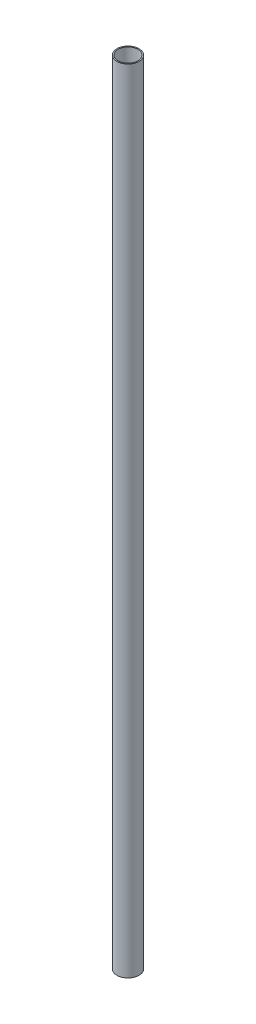
ISO-10303-21;
HEADER;
FILE_DESCRIPTION(('STEP AP214'),'2;1');
FILE_NAME('part.step','',(''),(''),'','','');
FILE_SCHEMA(('AUTOMOTIVE_DESIGN { 1 0 10303 214 1 1 1 1 }'));
ENDSEC;
DATA;
#1=APPLICATION_CONTEXT('core data for automotive mechanical design processes');
#2=APPLICATION_PROTOCOL_DEFINITION('international standard','automotive_design',2000,#1);
#3=PRODUCT_CONTEXT('',#1,'mechanical');
#4=PRODUCT('Part','Part','',(#3));
#5=PRODUCT_RELATED_PRODUCT_CATEGORY('part','',(#4));
#6=PRODUCT_DEFINITION_FORMATION('','',#4);
#7=PRODUCT_DEFINITION_CONTEXT('part definition',#1,'design');
#8=PRODUCT_DEFINITION('design','',#6,#7);
#9=PRODUCT_DEFINITION_SHAPE('','',#8);
#10=(LENGTH_UNIT() NAMED_UNIT(*) SI_UNIT(.MILLI.,.METRE.));
#11=(NAMED_UNIT(*) PLANE_ANGLE_UNIT() SI_UNIT($,.RADIAN.));
#12=(NAMED_UNIT(*) SI_UNIT($,.STERADIAN.) SOLID_ANGLE_UNIT());
#13=UNCERTAINTY_MEASURE_WITH_UNIT(LENGTH_MEASURE(1.E-05),#10,'distance_accuracy_value','');
#14=(GEOMETRIC_REPRESENTATION_CONTEXT(3) GLOBAL_UNCERTAINTY_ASSIGNED_CONTEXT((#13)) GLOBAL_UNIT_ASSIGNED_CONTEXT((#10,
#11,#12)) REPRESENTATION_CONTEXT('',''));
#15=CARTESIAN_POINT('',(0.,0.,0.));
#16=DIRECTION('',(0.,0.,1.));
#17=DIRECTION('',(1.,0.,0.));
#18=AXIS2_PLACEMENT_3D('',#15,#16,#17);
#19=CARTESIAN_POINT('',(0.,786.6,0.));
#20=DIRECTION('',(0.,1.,0.));
#21=DIRECTION('',(0.,0.,1.));
#22=AXIS2_PLACEMENT_3D('',#19,#20,#21);
#23=PLANE('',#22);
#24=CARTESIAN_POINT('',(0.,786.6,0.));
#25=DIRECTION('',(0.,1.,0.));
#26=DIRECTION('',(0.,0.,1.));
#27=AXIS2_PLACEMENT_3D('',#24,#25,#26);
#28=CIRCLE('',#27,11.);
#29=CARTESIAN_POINT('',(0.,786.6,11.));
#30=VERTEX_POINT('',#29);
#31=EDGE_CURVE('E10',#30,#30,#28,.T.);
#32=ORIENTED_EDGE('',*,*,#31,.T.);
#33=EDGE_LOOP('',(#32));
#34=FACE_BOUND('',#33,.T.);
#35=CARTESIAN_POINT('',(0.,786.6,0.));
#36=DIRECTION('',(0.,1.,0.));
#37=DIRECTION('',(0.,0.,1.));
#38=AXIS2_PLACEMENT_3D('',#35,#36,#37);
#39=CIRCLE('',#38,9.9);
#40=CARTESIAN_POINT('',(0.,786.6,9.9));
#41=VERTEX_POINT('',#40);
#42=EDGE_CURVE('E41',#41,#41,#39,.T.);
#43=ORIENTED_EDGE('',*,*,#42,.F.);
#44=EDGE_LOOP('',(#43));
#45=FACE_BOUND('',#44,.T.);
#46=ADVANCED_FACE('F30',(#34,#45),#23,.T.);
#47=CARTESIAN_POINT('',(0.,0.,0.));
#48=DIRECTION('',(0.,1.,0.));
#49=DIRECTION('',(0.,0.,1.));
#50=AXIS2_PLACEMENT_3D('',#47,#48,#49);
#51=PLANE('',#50);
#52=CARTESIAN_POINT('',(0.,0.,0.));
#53=DIRECTION('',(0.,1.,0.));
#54=DIRECTION('',(0.,0.,1.));
#55=AXIS2_PLACEMENT_3D('',#52,#53,#54);
#56=CIRCLE('',#55,11.);
#57=CARTESIAN_POINT('',(0.,0.,11.));
#58=VERTEX_POINT('',#57);
#59=EDGE_CURVE('E34',#58,#58,#56,.T.);
#60=ORIENTED_EDGE('',*,*,#59,.F.);
#61=EDGE_LOOP('',(#60));
#62=FACE_BOUND('',#61,.T.);
#63=CARTESIAN_POINT('',(0.,0.,0.));
#64=DIRECTION('',(0.,1.,0.));
#65=DIRECTION('',(0.,0.,1.));
#66=AXIS2_PLACEMENT_3D('',#63,#64,#65);
#67=CIRCLE('',#66,9.9);
#68=CARTESIAN_POINT('',(0.,0.,9.9));
#69=VERTEX_POINT('',#68);
#70=EDGE_CURVE('E43',#69,#69,#67,.T.);
#71=ORIENTED_EDGE('',*,*,#70,.T.);
#72=EDGE_LOOP('',(#71));
#73=FACE_BOUND('',#72,.T.);
#74=ADVANCED_FACE('F53',(#62,#73),#51,.F.);
#75=CARTESIAN_POINT('',(0.,786.6,0.));
#76=DIRECTION('',(0.,-1.,0.));
#77=DIRECTION('',(0.,0.,-1.));
#78=AXIS2_PLACEMENT_3D('',#75,#76,#77);
#79=CYLINDRICAL_SURFACE('',#78,11.);
#80=ORIENTED_EDGE('',*,*,#31,.F.);
#81=EDGE_LOOP('',(#80));
#82=FACE_BOUND('',#81,.T.);
#83=ORIENTED_EDGE('',*,*,#59,.T.);
#84=EDGE_LOOP('',(#83));
#85=FACE_BOUND('',#84,.T.);
#86=ADVANCED_FACE('F32',(#82,#85),#79,.T.);
#87=CARTESIAN_POINT('',(0.,786.6,0.));
#88=DIRECTION('',(0.,-1.,0.));
#89=DIRECTION('',(0.,0.,-1.));
#90=AXIS2_PLACEMENT_3D('',#87,#88,#89);
#91=CYLINDRICAL_SURFACE('',#90,9.9);
#92=ORIENTED_EDGE('',*,*,#42,.T.);
#93=EDGE_LOOP('',(#92));
#94=FACE_BOUND('',#93,.T.);
#95=ORIENTED_EDGE('',*,*,#70,.F.);
#96=EDGE_LOOP('',(#95));
#97=FACE_BOUND('',#96,.T.);
#98=ADVANCED_FACE('F49',(#94,#97),#91,.F.);
#99=CLOSED_SHELL('',(#46,#74,#86,#98));
#100=MANIFOLD_SOLID_BREP('B2',#99);
#101=ADVANCED_BREP_SHAPE_REPRESENTATION('',(#18,#100),#14);
#102=SHAPE_DEFINITION_REPRESENTATION(#9,#101);
ENDSEC;
END-ISO-10303-21;
